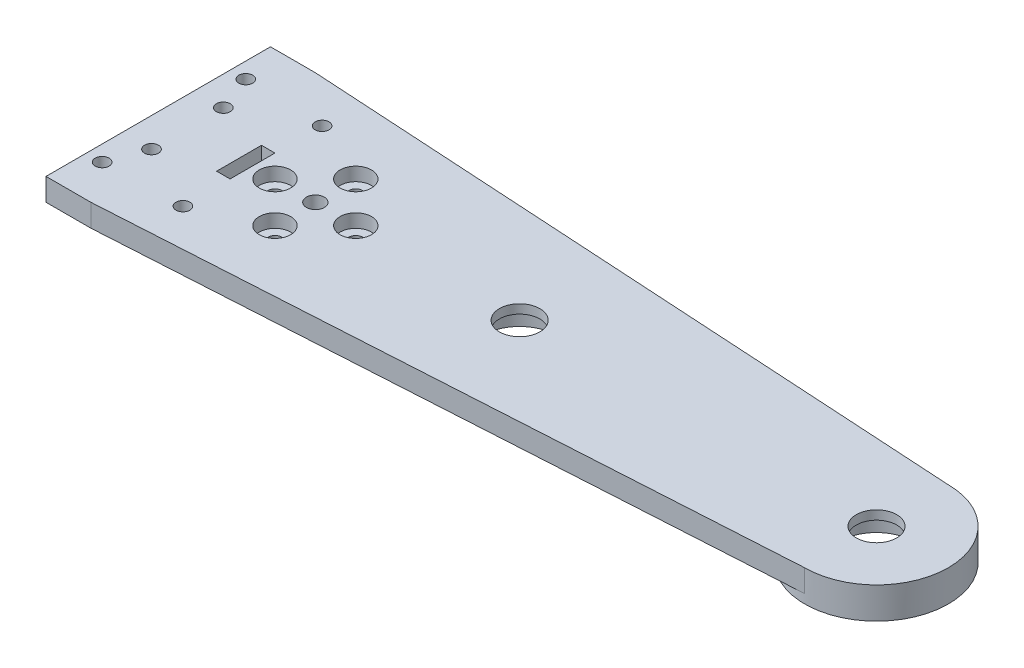
ISO-10303-21;
HEADER;
FILE_DESCRIPTION(('STEP AP214'),'2;1');
FILE_NAME('part.step','',(''),(''),'','','');
FILE_SCHEMA(('AUTOMOTIVE_DESIGN { 1 0 10303 214 1 1 1 1 }'));
ENDSEC;
DATA;
#1=APPLICATION_CONTEXT('core data for automotive mechanical design processes');
#2=APPLICATION_PROTOCOL_DEFINITION('international standard','automotive_design',2000,#1);
#3=PRODUCT_CONTEXT('',#1,'mechanical');
#4=PRODUCT('Part','Part','',(#3));
#5=PRODUCT_RELATED_PRODUCT_CATEGORY('part','',(#4));
#6=PRODUCT_DEFINITION_FORMATION('','',#4);
#7=PRODUCT_DEFINITION_CONTEXT('part definition',#1,'design');
#8=PRODUCT_DEFINITION('design','',#6,#7);
#9=PRODUCT_DEFINITION_SHAPE('','',#8);
#10=(LENGTH_UNIT() NAMED_UNIT(*) SI_UNIT(.MILLI.,.METRE.));
#11=(NAMED_UNIT(*) PLANE_ANGLE_UNIT() SI_UNIT($,.RADIAN.));
#12=(NAMED_UNIT(*) SI_UNIT($,.STERADIAN.) SOLID_ANGLE_UNIT());
#13=UNCERTAINTY_MEASURE_WITH_UNIT(LENGTH_MEASURE(1.E-05),#10,'distance_accuracy_value','');
#14=(GEOMETRIC_REPRESENTATION_CONTEXT(3) GLOBAL_UNCERTAINTY_ASSIGNED_CONTEXT((#13)) GLOBAL_UNIT_ASSIGNED_CONTEXT((#10,
#11,#12)) REPRESENTATION_CONTEXT('',''));
#15=CARTESIAN_POINT('',(0.,0.,0.));
#16=DIRECTION('',(0.,0.,1.));
#17=DIRECTION('',(1.,0.,0.));
#18=AXIS2_PLACEMENT_3D('',#15,#16,#17);
#19=CARTESIAN_POINT('',(-12.,-5.,-9.));
#20=DIRECTION('',(0.,1.,0.));
#21=DIRECTION('',(0.,0.,1.));
#22=AXIS2_PLACEMENT_3D('',#19,#20,#21);
#23=CYLINDRICAL_SURFACE('',#22,1.55);
#24=CARTESIAN_POINT('',(-12.,-5.,-9.));
#25=DIRECTION('',(0.,-1.,0.));
#26=DIRECTION('',(0.,0.,-1.));
#27=AXIS2_PLACEMENT_3D('',#24,#25,#26);
#28=CIRCLE('',#27,1.55);
#29=CARTESIAN_POINT('',(-12.,-5.,-10.55));
#30=VERTEX_POINT('',#29);
#31=EDGE_CURVE('E166',#30,#30,#28,.T.);
#32=ORIENTED_EDGE('',*,*,#31,.T.);
#33=EDGE_LOOP('',(#32));
#34=FACE_BOUND('',#33,.T.);
#35=CARTESIAN_POINT('',(-12.,-3.,-9.));
#36=DIRECTION('',(0.,1.,0.));
#37=DIRECTION('',(0.,0.,1.));
#38=AXIS2_PLACEMENT_3D('',#35,#36,#37);
#39=CIRCLE('',#38,1.55);
#40=CARTESIAN_POINT('',(-12.,-3.,-7.45));
#41=VERTEX_POINT('',#40);
#42=EDGE_CURVE('E42',#41,#41,#39,.T.);
#43=ORIENTED_EDGE('',*,*,#42,.T.);
#44=EDGE_LOOP('',(#43));
#45=FACE_BOUND('',#44,.T.);
#46=ADVANCED_FACE('F38',(#34,#45),#23,.F.);
#47=CARTESIAN_POINT('',(-21.,-5.,0.));
#48=DIRECTION('',(0.,1.,0.));
#49=DIRECTION('',(0.,0.,1.));
#50=AXIS2_PLACEMENT_3D('',#47,#48,#49);
#51=CYLINDRICAL_SURFACE('',#50,1.55);
#52=CARTESIAN_POINT('',(-21.,-5.,0.));
#53=DIRECTION('',(0.,-1.,0.));
#54=DIRECTION('',(0.,0.,-1.));
#55=AXIS2_PLACEMENT_3D('',#52,#53,#54);
#56=CIRCLE('',#55,1.55);
#57=CARTESIAN_POINT('',(-21.,-5.,-1.54999999999997));
#58=VERTEX_POINT('',#57);
#59=EDGE_CURVE('E163',#58,#58,#56,.T.);
#60=ORIENTED_EDGE('',*,*,#59,.T.);
#61=EDGE_LOOP('',(#60));
#62=FACE_BOUND('',#61,.T.);
#63=CARTESIAN_POINT('',(-21.,-3.,0.));
#64=DIRECTION('',(0.,1.,0.));
#65=DIRECTION('',(0.,0.,1.));
#66=AXIS2_PLACEMENT_3D('',#63,#64,#65);
#67=CIRCLE('',#66,1.55);
#68=CARTESIAN_POINT('',(-21.,-3.,1.55000000000003));
#69=VERTEX_POINT('',#68);
#70=EDGE_CURVE('E279',#69,#69,#67,.T.);
#71=ORIENTED_EDGE('',*,*,#70,.T.);
#72=EDGE_LOOP('',(#71));
#73=FACE_BOUND('',#72,.T.);
#74=ADVANCED_FACE('F382',(#62,#73),#51,.F.);
#75=CARTESIAN_POINT('',(-11.9999999999999,-5.,9.));
#76=DIRECTION('',(0.,1.,0.));
#77=DIRECTION('',(0.,0.,1.));
#78=AXIS2_PLACEMENT_3D('',#75,#76,#77);
#79=CYLINDRICAL_SURFACE('',#78,1.55);
#80=CARTESIAN_POINT('',(-11.9999999999999,-5.,9.));
#81=DIRECTION('',(0.,-1.,0.));
#82=DIRECTION('',(0.,0.,-1.));
#83=AXIS2_PLACEMENT_3D('',#80,#81,#82);
#84=CIRCLE('',#83,1.55);
#85=CARTESIAN_POINT('',(-11.9999999999999,-5.,7.45));
#86=VERTEX_POINT('',#85);
#87=EDGE_CURVE('E160',#86,#86,#84,.T.);
#88=ORIENTED_EDGE('',*,*,#87,.T.);
#89=EDGE_LOOP('',(#88));
#90=FACE_BOUND('',#89,.T.);
#91=CARTESIAN_POINT('',(-11.9999999999999,-3.,9.));
#92=DIRECTION('',(0.,1.,0.));
#93=DIRECTION('',(0.,0.,1.));
#94=AXIS2_PLACEMENT_3D('',#91,#92,#93);
#95=CIRCLE('',#94,1.55);
#96=CARTESIAN_POINT('',(-11.9999999999999,-3.,10.55));
#97=VERTEX_POINT('',#96);
#98=EDGE_CURVE('E276',#97,#97,#95,.T.);
#99=ORIENTED_EDGE('',*,*,#98,.T.);
#100=EDGE_LOOP('',(#99));
#101=FACE_BOUND('',#100,.T.);
#102=ADVANCED_FACE('F387',(#90,#101),#79,.F.);
#103=CARTESIAN_POINT('',(-2.99999999999999,-5.,0.));
#104=DIRECTION('',(0.,1.,0.));
#105=DIRECTION('',(0.,0.,1.));
#106=AXIS2_PLACEMENT_3D('',#103,#104,#105);
#107=CYLINDRICAL_SURFACE('',#106,1.55);
#108=CARTESIAN_POINT('',(-2.99999999999999,-5.,0.));
#109=DIRECTION('',(0.,-1.,0.));
#110=DIRECTION('',(0.,0.,-1.));
#111=AXIS2_PLACEMENT_3D('',#108,#109,#110);
#112=CIRCLE('',#111,1.55);
#113=CARTESIAN_POINT('',(-2.99999999999999,-5.,-1.55000000000009));
#114=VERTEX_POINT('',#113);
#115=EDGE_CURVE('E155',#114,#114,#112,.T.);
#116=ORIENTED_EDGE('',*,*,#115,.T.);
#117=EDGE_LOOP('',(#116));
#118=FACE_BOUND('',#117,.T.);
#119=CARTESIAN_POINT('',(-2.99999999999999,-3.,0.));
#120=DIRECTION('',(0.,1.,0.));
#121=DIRECTION('',(0.,0.,1.));
#122=AXIS2_PLACEMENT_3D('',#119,#120,#121);
#123=CIRCLE('',#122,1.55);
#124=CARTESIAN_POINT('',(-2.99999999999999,-3.,1.54999999999991));
#125=VERTEX_POINT('',#124);
#126=EDGE_CURVE('E273',#125,#125,#123,.T.);
#127=ORIENTED_EDGE('',*,*,#126,.T.);
#128=EDGE_LOOP('',(#127));
#129=FACE_BOUND('',#128,.T.);
#130=ADVANCED_FACE('F393',(#118,#129),#107,.F.);
#131=CARTESIAN_POINT('',(33.5,-5.,0.));
#132=DIRECTION('',(0.,1.,0.));
#133=DIRECTION('',(0.,0.,1.));
#134=AXIS2_PLACEMENT_3D('',#131,#132,#133);
#135=CYLINDRICAL_SURFACE('',#134,4.5);
#136=CARTESIAN_POINT('',(33.5,0.,0.));
#137=DIRECTION('',(0.,-1.,0.));
#138=DIRECTION('',(0.,0.,-1.));
#139=AXIS2_PLACEMENT_3D('',#136,#137,#138);
#140=CIRCLE('',#139,4.5);
#141=CARTESIAN_POINT('',(33.5,0.,-4.5));
#142=VERTEX_POINT('',#141);
#143=EDGE_CURVE('E231',#142,#142,#140,.T.);
#144=ORIENTED_EDGE('',*,*,#143,.F.);
#145=EDGE_LOOP('',(#144));
#146=FACE_BOUND('',#145,.T.);
#147=CARTESIAN_POINT('',(33.5,-2.,0.));
#148=DIRECTION('',(0.,-1.,0.));
#149=DIRECTION('',(0.,0.,-1.));
#150=AXIS2_PLACEMENT_3D('',#147,#148,#149);
#151=CIRCLE('',#150,4.5);
#152=CARTESIAN_POINT('',(33.5,-2.,-4.5));
#153=VERTEX_POINT('',#152);
#154=EDGE_CURVE('E142',#153,#153,#151,.T.);
#155=ORIENTED_EDGE('',*,*,#154,.T.);
#156=EDGE_LOOP('',(#155));
#157=FACE_BOUND('',#156,.T.);
#158=ADVANCED_FACE('F396',(#146,#157),#135,.F.);
#159=CARTESIAN_POINT('',(113.,-5.,0.));
#160=DIRECTION('',(0.,1.,0.));
#161=DIRECTION('',(0.,0.,1.));
#162=AXIS2_PLACEMENT_3D('',#159,#160,#161);
#163=CYLINDRICAL_SURFACE('',#162,4.5);
#164=CARTESIAN_POINT('',(113.,0.,0.));
#165=DIRECTION('',(0.,-1.,0.));
#166=DIRECTION('',(0.,0.,-1.));
#167=AXIS2_PLACEMENT_3D('',#164,#165,#166);
#168=CIRCLE('',#167,4.5);
#169=CARTESIAN_POINT('',(113.,0.,-4.49999999999999));
#170=VERTEX_POINT('',#169);
#171=EDGE_CURVE('E222',#170,#170,#168,.T.);
#172=ORIENTED_EDGE('',*,*,#171,.F.);
#173=EDGE_LOOP('',(#172));
#174=FACE_BOUND('',#173,.T.);
#175=CARTESIAN_POINT('',(113.,-2.,0.));
#176=DIRECTION('',(0.,-1.,0.));
#177=DIRECTION('',(0.,0.,-1.));
#178=AXIS2_PLACEMENT_3D('',#175,#176,#177);
#179=CIRCLE('',#178,4.5);
#180=CARTESIAN_POINT('',(113.,-2.,-4.49999999999999));
#181=VERTEX_POINT('',#180);
#182=EDGE_CURVE('E148',#181,#181,#179,.T.);
#183=ORIENTED_EDGE('',*,*,#182,.T.);
#184=EDGE_LOOP('',(#183));
#185=FACE_BOUND('',#184,.T.);
#186=ADVANCED_FACE('F520',(#174,#185),#163,.F.);
#187=CARTESIAN_POINT('',(113.,-5.,0.));
#188=DIRECTION('',(0.,-1.,0.));
#189=DIRECTION('',(0.,0.,-1.));
#190=AXIS2_PLACEMENT_3D('',#187,#188,#189);
#191=PLANE('',#190);
#192=ORIENTED_EDGE('',*,*,#115,.F.);
#193=EDGE_LOOP('',(#192));
#194=FACE_BOUND('',#193,.T.);
#195=ORIENTED_EDGE('',*,*,#59,.F.);
#196=EDGE_LOOP('',(#195));
#197=FACE_BOUND('',#196,.T.);
#198=CARTESIAN_POINT('',(-26.,-5.,15.5));
#199=DIRECTION('',(0.,-1.,0.));
#200=DIRECTION('',(0.,0.,-1.));
#201=AXIS2_PLACEMENT_3D('',#198,#199,#200);
#202=CIRCLE('',#201,1.55);
#203=CARTESIAN_POINT('',(-26.,-5.,13.95));
#204=VERTEX_POINT('',#203);
#205=EDGE_CURVE('E170',#204,#204,#202,.T.);
#206=ORIENTED_EDGE('',*,*,#205,.F.);
#207=EDGE_LOOP('',(#206));
#208=FACE_BOUND('',#207,.T.);
#209=DIRECTION('',(0.,0.,-1.));
#210=VECTOR('',#209,1.);
#211=CARTESIAN_POINT('',(-29.,-5.,-5.));
#212=LINE('',#211,#210);
#213=CARTESIAN_POINT('',(-29.,-5.,5.));
#214=VERTEX_POINT('',#213);
#215=CARTESIAN_POINT('',(-29.,-5.,-5.));
#216=VERTEX_POINT('',#215);
#217=EDGE_CURVE('E183',#214,#216,#212,.T.);
#218=ORIENTED_EDGE('',*,*,#217,.F.);
#219=DIRECTION('',(-1.,0.,0.));
#220=VECTOR('',#219,1.);
#221=CARTESIAN_POINT('',(-29.,-5.,5.));
#222=LINE('',#221,#220);
#223=CARTESIAN_POINT('',(-26.,-5.,5.));
#224=VERTEX_POINT('',#223);
#225=EDGE_CURVE('E181',#224,#214,#222,.T.);
#226=ORIENTED_EDGE('',*,*,#225,.F.);
#227=DIRECTION('',(0.,0.,1.));
#228=VECTOR('',#227,1.);
#229=CARTESIAN_POINT('',(-26.,-5.,5.));
#230=LINE('',#229,#228);
#231=CARTESIAN_POINT('',(-26.,-5.,-5.));
#232=VERTEX_POINT('',#231);
#233=EDGE_CURVE('E188',#232,#224,#230,.T.);
#234=ORIENTED_EDGE('',*,*,#233,.F.);
#235=DIRECTION('',(1.,0.,0.));
#236=VECTOR('',#235,1.);
#237=CARTESIAN_POINT('',(-26.,-5.,-5.));
#238=LINE('',#237,#236);
#239=EDGE_CURVE('E186',#216,#232,#238,.T.);
#240=ORIENTED_EDGE('',*,*,#239,.F.);
#241=EDGE_LOOP('',(#218,#226,#234,#240));
#242=FACE_BOUND('',#241,.T.);
#243=CARTESIAN_POINT('',(-43.5,-5.,-16.));
#244=DIRECTION('',(0.,-1.,0.));
#245=DIRECTION('',(0.,0.,-1.));
#246=AXIS2_PLACEMENT_3D('',#243,#244,#245);
#247=CIRCLE('',#246,1.55);
#248=CARTESIAN_POINT('',(-43.5,-5.,-17.55));
#249=VERTEX_POINT('',#248);
#250=EDGE_CURVE('E207',#249,#249,#247,.T.);
#251=ORIENTED_EDGE('',*,*,#250,.F.);
#252=EDGE_LOOP('',(#251));
#253=FACE_BOUND('',#252,.T.);
#254=CARTESIAN_POINT('',(-40.5,-5.,-7.99999999999999));
#255=DIRECTION('',(0.,-1.,0.));
#256=DIRECTION('',(0.,0.,-1.));
#257=AXIS2_PLACEMENT_3D('',#254,#255,#256);
#258=CIRCLE('',#257,1.55);
#259=CARTESIAN_POINT('',(-40.5,-5.,-9.54999999999999));
#260=VERTEX_POINT('',#259);
#261=EDGE_CURVE('E219',#260,#260,#258,.T.);
#262=ORIENTED_EDGE('',*,*,#261,.F.);
#263=EDGE_LOOP('',(#262));
#264=FACE_BOUND('',#263,.T.);
#265=CARTESIAN_POINT('',(-40.5,-5.,8.00000000000001));
#266=DIRECTION('',(0.,-1.,0.));
#267=DIRECTION('',(0.,0.,-1.));
#268=AXIS2_PLACEMENT_3D('',#265,#266,#267);
#269=CIRCLE('',#268,1.55);
#270=CARTESIAN_POINT('',(-40.5,-5.,6.45000000000001));
#271=VERTEX_POINT('',#270);
#272=EDGE_CURVE('E228',#271,#271,#269,.T.);
#273=ORIENTED_EDGE('',*,*,#272,.F.);
#274=EDGE_LOOP('',(#273));
#275=FACE_BOUND('',#274,.T.);
#276=CARTESIAN_POINT('',(-12.,-5.,0.));
#277=DIRECTION('',(0.,-1.,0.));
#278=DIRECTION('',(0.,0.,-1.));
#279=AXIS2_PLACEMENT_3D('',#276,#277,#278);
#280=CIRCLE('',#279,2.);
#281=CARTESIAN_POINT('',(-12.,-5.,-2.));
#282=VERTEX_POINT('',#281);
#283=EDGE_CURVE('E237',#282,#282,#280,.T.);
#284=ORIENTED_EDGE('',*,*,#283,.F.);
#285=EDGE_LOOP('',(#284));
#286=FACE_BOUND('',#285,.T.);
#287=CARTESIAN_POINT('',(-43.5,-5.,16.));
#288=DIRECTION('',(0.,-1.,0.));
#289=DIRECTION('',(0.,0.,-1.));
#290=AXIS2_PLACEMENT_3D('',#287,#288,#289);
#291=CIRCLE('',#290,1.55);
#292=CARTESIAN_POINT('',(-43.5,-5.,14.45));
#293=VERTEX_POINT('',#292);
#294=EDGE_CURVE('E213',#293,#293,#291,.T.);
#295=ORIENTED_EDGE('',*,*,#294,.F.);
#296=EDGE_LOOP('',(#295));
#297=FACE_BOUND('',#296,.T.);
#298=CARTESIAN_POINT('',(-26.,-5.,-15.5));
#299=DIRECTION('',(0.,-1.,0.));
#300=DIRECTION('',(0.,0.,-1.));
#301=AXIS2_PLACEMENT_3D('',#298,#299,#300);
#302=CIRCLE('',#301,1.55);
#303=CARTESIAN_POINT('',(-26.,-5.,-17.05));
#304=VERTEX_POINT('',#303);
#305=EDGE_CURVE('E176',#304,#304,#302,.T.);
#306=ORIENTED_EDGE('',*,*,#305,.F.);
#307=EDGE_LOOP('',(#306));
#308=FACE_BOUND('',#307,.T.);
#309=ORIENTED_EDGE('',*,*,#31,.F.);
#310=EDGE_LOOP('',(#309));
#311=FACE_BOUND('',#310,.T.);
#312=ORIENTED_EDGE('',*,*,#87,.F.);
#313=EDGE_LOOP('',(#312));
#314=FACE_BOUND('',#313,.T.);
#315=CARTESIAN_POINT('',(33.5,-5.,0.));
#316=DIRECTION('',(0.,-1.,0.));
#317=DIRECTION('',(0.,0.,-1.));
#318=AXIS2_PLACEMENT_3D('',#315,#316,#317);
#319=CIRCLE('',#318,16.);
#320=CARTESIAN_POINT('',(33.5,-5.,-16.));
#321=VERTEX_POINT('',#320);
#322=EDGE_CURVE('E145',#321,#321,#319,.T.);
#323=ORIENTED_EDGE('',*,*,#322,.F.);
#324=EDGE_LOOP('',(#323));
#325=FACE_BOUND('',#324,.T.);
#326=DIRECTION('',(0.998204845465779,0.,0.0598922907279467));
#327=VECTOR('',#326,1.);
#328=CARTESIAN_POINT('',(-37.,-5.,-25.));
#329=LINE('',#328,#327);
#330=CARTESIAN_POINT('',(-37.,-5.,-25.));
#331=VERTEX_POINT('',#330);
#332=CARTESIAN_POINT('',(113.,-5.,-16.));
#333=VERTEX_POINT('',#332);
#334=EDGE_CURVE('E129',#331,#333,#329,.T.);
#335=ORIENTED_EDGE('',*,*,#334,.T.);
#336=CARTESIAN_POINT('',(113.,-5.,0.));
#337=DIRECTION('',(0.,-1.,0.));
#338=DIRECTION('',(0.,0.,-1.));
#339=AXIS2_PLACEMENT_3D('',#336,#337,#338);
#340=CIRCLE('',#339,16.);
#341=CARTESIAN_POINT('',(113.,-5.,16.));
#342=VERTEX_POINT('',#341);
#343=EDGE_CURVE('E135',#342,#333,#340,.T.);
#344=ORIENTED_EDGE('',*,*,#343,.F.);
#345=DIRECTION('',(-0.998204845465779,0.,0.0598922907279467));
#346=VECTOR('',#345,1.);
#347=CARTESIAN_POINT('',(113.,-5.,16.));
#348=LINE('',#347,#346);
#349=CARTESIAN_POINT('',(-37.,-5.,25.));
#350=VERTEX_POINT('',#349);
#351=EDGE_CURVE('E119',#342,#350,#348,.T.);
#352=ORIENTED_EDGE('',*,*,#351,.T.);
#353=DIRECTION('',(-1.,0.,0.));
#354=VECTOR('',#353,1.);
#355=CARTESIAN_POINT('',(-47.,-5.,25.));
#356=LINE('',#355,#354);
#357=CARTESIAN_POINT('',(-47.,-5.,25.));
#358=VERTEX_POINT('',#357);
#359=EDGE_CURVE('E128',#350,#358,#356,.T.);
#360=ORIENTED_EDGE('',*,*,#359,.T.);
#361=DIRECTION('',(0.,0.,-1.));
#362=VECTOR('',#361,1.);
#363=CARTESIAN_POINT('',(-47.,-5.,-25.));
#364=LINE('',#363,#362);
#365=CARTESIAN_POINT('',(-47.,-5.,-25.));
#366=VERTEX_POINT('',#365);
#367=EDGE_CURVE('E246',#358,#366,#364,.T.);
#368=ORIENTED_EDGE('',*,*,#367,.T.);
#369=DIRECTION('',(1.,0.,0.));
#370=VECTOR('',#369,1.);
#371=CARTESIAN_POINT('',(-47.,-5.,-25.));
#372=LINE('',#371,#370);
#373=EDGE_CURVE('E248',#366,#331,#372,.T.);
#374=ORIENTED_EDGE('',*,*,#373,.T.);
#375=EDGE_LOOP('',(#335,#344,#352,#360,#368,#374));
#376=FACE_BOUND('',#375,.T.);
#377=ADVANCED_FACE('F138',(#194,#197,#208,#242,#253,#264,#275,#286,#297,#308,#311,#314,#325,
#376),#191,.T.);
#378=CARTESIAN_POINT('',(113.,0.,0.));
#379=DIRECTION('',(0.,-1.,0.));
#380=DIRECTION('',(0.,0.,-1.));
#381=AXIS2_PLACEMENT_3D('',#378,#379,#380);
#382=PLANE('',#381);
#383=CARTESIAN_POINT('',(-12.,0.,-9.));
#384=DIRECTION('',(0.,1.,0.));
#385=DIRECTION('',(0.,0.,1.));
#386=AXIS2_PLACEMENT_3D('',#383,#384,#385);
#387=CIRCLE('',#386,3.5);
#388=CARTESIAN_POINT('',(-12.,0.,-5.5));
#389=VERTEX_POINT('',#388);
#390=EDGE_CURVE('E317',#389,#389,#387,.T.);
#391=ORIENTED_EDGE('',*,*,#390,.F.);
#392=EDGE_LOOP('',(#391));
#393=FACE_BOUND('',#392,.T.);
#394=CARTESIAN_POINT('',(-2.99999999999999,0.,0.));
#395=DIRECTION('',(0.,1.,0.));
#396=DIRECTION('',(0.,0.,1.));
#397=AXIS2_PLACEMENT_3D('',#394,#395,#396);
#398=CIRCLE('',#397,3.5);
#399=CARTESIAN_POINT('',(-2.99999999999999,0.,3.50000000000003));
#400=VERTEX_POINT('',#399);
#401=EDGE_CURVE('E311',#400,#400,#398,.T.);
#402=ORIENTED_EDGE('',*,*,#401,.F.);
#403=EDGE_LOOP('',(#402));
#404=FACE_BOUND('',#403,.T.);
#405=CARTESIAN_POINT('',(-12.,0.,9.));
#406=DIRECTION('',(0.,1.,0.));
#407=DIRECTION('',(0.,0.,1.));
#408=AXIS2_PLACEMENT_3D('',#405,#406,#407);
#409=CIRCLE('',#408,3.5);
#410=CARTESIAN_POINT('',(-12.,0.,12.5));
#411=VERTEX_POINT('',#410);
#412=EDGE_CURVE('E305',#411,#411,#409,.T.);
#413=ORIENTED_EDGE('',*,*,#412,.F.);
#414=EDGE_LOOP('',(#413));
#415=FACE_BOUND('',#414,.T.);
#416=CARTESIAN_POINT('',(-21.,0.,0.));
#417=DIRECTION('',(0.,1.,0.));
#418=DIRECTION('',(0.,0.,1.));
#419=AXIS2_PLACEMENT_3D('',#416,#417,#418);
#420=CIRCLE('',#419,3.5);
#421=CARTESIAN_POINT('',(-21.,0.,3.49999999999991));
#422=VERTEX_POINT('',#421);
#423=EDGE_CURVE('E299',#422,#422,#420,.T.);
#424=ORIENTED_EDGE('',*,*,#423,.F.);
#425=EDGE_LOOP('',(#424));
#426=FACE_BOUND('',#425,.T.);
#427=CARTESIAN_POINT('',(-43.5,0.,-16.));
#428=DIRECTION('',(0.,-1.,0.));
#429=DIRECTION('',(0.,0.,-1.));
#430=AXIS2_PLACEMENT_3D('',#427,#428,#429);
#431=CIRCLE('',#430,1.55);
#432=CARTESIAN_POINT('',(-43.5,0.,-17.55));
#433=VERTEX_POINT('',#432);
#434=EDGE_CURVE('E206',#433,#433,#431,.T.);
#435=ORIENTED_EDGE('',*,*,#434,.T.);
#436=EDGE_LOOP('',(#435));
#437=FACE_BOUND('',#436,.T.);
#438=CARTESIAN_POINT('',(-43.5,0.,16.));
#439=DIRECTION('',(0.,-1.,0.));
#440=DIRECTION('',(0.,0.,-1.));
#441=AXIS2_PLACEMENT_3D('',#438,#439,#440);
#442=CIRCLE('',#441,1.55);
#443=CARTESIAN_POINT('',(-43.5,0.,14.45));
#444=VERTEX_POINT('',#443);
#445=EDGE_CURVE('E210',#444,#444,#442,.T.);
#446=ORIENTED_EDGE('',*,*,#445,.T.);
#447=EDGE_LOOP('',(#446));
#448=FACE_BOUND('',#447,.T.);
#449=CARTESIAN_POINT('',(-40.5,0.,-7.99999999999999));
#450=DIRECTION('',(0.,-1.,0.));
#451=DIRECTION('',(0.,0.,-1.));
#452=AXIS2_PLACEMENT_3D('',#449,#450,#451);
#453=CIRCLE('',#452,1.55);
#454=CARTESIAN_POINT('',(-40.5,0.,-9.54999999999999));
#455=VERTEX_POINT('',#454);
#456=EDGE_CURVE('E216',#455,#455,#453,.T.);
#457=ORIENTED_EDGE('',*,*,#456,.T.);
#458=EDGE_LOOP('',(#457));
#459=FACE_BOUND('',#458,.T.);
#460=ORIENTED_EDGE('',*,*,#171,.T.);
#461=EDGE_LOOP('',(#460));
#462=FACE_BOUND('',#461,.T.);
#463=CARTESIAN_POINT('',(-40.5,0.,8.00000000000001));
#464=DIRECTION('',(0.,-1.,0.));
#465=DIRECTION('',(0.,0.,-1.));
#466=AXIS2_PLACEMENT_3D('',#463,#464,#465);
#467=CIRCLE('',#466,1.55);
#468=CARTESIAN_POINT('',(-40.5,0.,6.45000000000001));
#469=VERTEX_POINT('',#468);
#470=EDGE_CURVE('E227',#469,#469,#467,.T.);
#471=ORIENTED_EDGE('',*,*,#470,.T.);
#472=EDGE_LOOP('',(#471));
#473=FACE_BOUND('',#472,.T.);
#474=ORIENTED_EDGE('',*,*,#143,.T.);
#475=EDGE_LOOP('',(#474));
#476=FACE_BOUND('',#475,.T.);
#477=CARTESIAN_POINT('',(-12.,0.,0.));
#478=DIRECTION('',(0.,-1.,0.));
#479=DIRECTION('',(0.,0.,-1.));
#480=AXIS2_PLACEMENT_3D('',#477,#478,#479);
#481=CIRCLE('',#480,2.);
#482=CARTESIAN_POINT('',(-12.,0.,-2.));
#483=VERTEX_POINT('',#482);
#484=EDGE_CURVE('E236',#483,#483,#481,.T.);
#485=ORIENTED_EDGE('',*,*,#484,.T.);
#486=EDGE_LOOP('',(#485));
#487=FACE_BOUND('',#486,.T.);
#488=DIRECTION('',(0.998204845465779,0.,0.0598922907279467));
#489=VECTOR('',#488,1.);
#490=CARTESIAN_POINT('',(-37.,0.,-25.));
#491=LINE('',#490,#489);
#492=CARTESIAN_POINT('',(-37.,0.,-25.));
#493=VERTEX_POINT('',#492);
#494=CARTESIAN_POINT('',(113.,0.,-16.));
#495=VERTEX_POINT('',#494);
#496=EDGE_CURVE('E240',#493,#495,#491,.T.);
#497=ORIENTED_EDGE('',*,*,#496,.F.);
#498=DIRECTION('',(1.,0.,0.));
#499=VECTOR('',#498,1.);
#500=CARTESIAN_POINT('',(-47.,0.,-25.));
#501=LINE('',#500,#499);
#502=CARTESIAN_POINT('',(-47.,0.,-25.));
#503=VERTEX_POINT('',#502);
#504=EDGE_CURVE('E243',#503,#493,#501,.T.);
#505=ORIENTED_EDGE('',*,*,#504,.F.);
#506=DIRECTION('',(0.,0.,-1.));
#507=VECTOR('',#506,1.);
#508=CARTESIAN_POINT('',(-47.,0.,-25.));
#509=LINE('',#508,#507);
#510=CARTESIAN_POINT('',(-47.,0.,25.));
#511=VERTEX_POINT('',#510);
#512=EDGE_CURVE('E258',#511,#503,#509,.T.);
#513=ORIENTED_EDGE('',*,*,#512,.F.);
#514=DIRECTION('',(-1.,0.,0.));
#515=VECTOR('',#514,1.);
#516=CARTESIAN_POINT('',(-47.,0.,25.));
#517=LINE('',#516,#515);
#518=CARTESIAN_POINT('',(-37.,0.,25.));
#519=VERTEX_POINT('',#518);
#520=EDGE_CURVE('E256',#519,#511,#517,.T.);
#521=ORIENTED_EDGE('',*,*,#520,.F.);
#522=DIRECTION('',(-0.998204845465779,0.,0.0598922907279467));
#523=VECTOR('',#522,1.);
#524=CARTESIAN_POINT('',(113.,0.,16.));
#525=LINE('',#524,#523);
#526=CARTESIAN_POINT('',(113.,0.,16.));
#527=VERTEX_POINT('',#526);
#528=EDGE_CURVE('E254',#527,#519,#525,.T.);
#529=ORIENTED_EDGE('',*,*,#528,.F.);
#530=CARTESIAN_POINT('',(113.,0.,0.));
#531=DIRECTION('',(0.,-1.,0.));
#532=DIRECTION('',(0.,0.,-1.));
#533=AXIS2_PLACEMENT_3D('',#530,#531,#532);
#534=CIRCLE('',#533,16.);
#535=EDGE_CURVE('E136',#495,#527,#534,.T.);
#536=ORIENTED_EDGE('',*,*,#535,.F.);
#537=EDGE_LOOP('',(#497,#505,#513,#521,#529,#536));
#538=FACE_BOUND('',#537,.T.);
#539=DIRECTION('',(-1.,0.,0.));
#540=VECTOR('',#539,1.);
#541=CARTESIAN_POINT('',(-29.,0.,5.));
#542=LINE('',#541,#540);
#543=CARTESIAN_POINT('',(-26.,0.,5.));
#544=VERTEX_POINT('',#543);
#545=CARTESIAN_POINT('',(-29.,0.,5.));
#546=VERTEX_POINT('',#545);
#547=EDGE_CURVE('E63',#544,#546,#542,.T.);
#548=ORIENTED_EDGE('',*,*,#547,.T.);
#549=DIRECTION('',(0.,0.,-1.));
#550=VECTOR('',#549,1.);
#551=CARTESIAN_POINT('',(-29.,0.,-5.));
#552=LINE('',#551,#550);
#553=CARTESIAN_POINT('',(-29.,0.,-5.));
#554=VERTEX_POINT('',#553);
#555=EDGE_CURVE('E192',#546,#554,#552,.T.);
#556=ORIENTED_EDGE('',*,*,#555,.T.);
#557=DIRECTION('',(1.,0.,0.));
#558=VECTOR('',#557,1.);
#559=CARTESIAN_POINT('',(-26.,0.,-5.));
#560=LINE('',#559,#558);
#561=CARTESIAN_POINT('',(-26.,0.,-5.));
#562=VERTEX_POINT('',#561);
#563=EDGE_CURVE('E195',#554,#562,#560,.T.);
#564=ORIENTED_EDGE('',*,*,#563,.T.);
#565=DIRECTION('',(0.,0.,1.));
#566=VECTOR('',#565,1.);
#567=CARTESIAN_POINT('',(-26.,0.,5.));
#568=LINE('',#567,#566);
#569=EDGE_CURVE('E184',#562,#544,#568,.T.);
#570=ORIENTED_EDGE('',*,*,#569,.T.);
#571=EDGE_LOOP('',(#548,#556,#564,#570));
#572=FACE_BOUND('',#571,.T.);
#573=CARTESIAN_POINT('',(-26.,0.,-15.5));
#574=DIRECTION('',(0.,-1.,0.));
#575=DIRECTION('',(0.,0.,-1.));
#576=AXIS2_PLACEMENT_3D('',#573,#574,#575);
#577=CIRCLE('',#576,1.55);
#578=CARTESIAN_POINT('',(-26.,0.,-17.05));
#579=VERTEX_POINT('',#578);
#580=EDGE_CURVE('E173',#579,#579,#577,.T.);
#581=ORIENTED_EDGE('',*,*,#580,.T.);
#582=EDGE_LOOP('',(#581));
#583=FACE_BOUND('',#582,.T.);
#584=CARTESIAN_POINT('',(-26.,0.,15.5));
#585=DIRECTION('',(0.,-1.,0.));
#586=DIRECTION('',(0.,0.,-1.));
#587=AXIS2_PLACEMENT_3D('',#584,#585,#586);
#588=CIRCLE('',#587,1.55);
#589=CARTESIAN_POINT('',(-26.,0.,13.95));
#590=VERTEX_POINT('',#589);
#591=EDGE_CURVE('E169',#590,#590,#588,.T.);
#592=ORIENTED_EDGE('',*,*,#591,.T.);
#593=EDGE_LOOP('',(#592));
#594=FACE_BOUND('',#593,.T.);
#595=ADVANCED_FACE('F332',(#393,#404,#415,#426,#437,#448,#459,#462,#473,#476,#487,#538,#572,
#583,#594),#382,.F.);
#596=CARTESIAN_POINT('',(-37.,-5.,-25.));
#597=DIRECTION('',(-0.0598922907279467,0.,0.998204845465779));
#598=DIRECTION('',(0.998204845465779,0.,0.0598922907279467));
#599=AXIS2_PLACEMENT_3D('',#596,#597,#598);
#600=PLANE('',#599);
#601=ORIENTED_EDGE('',*,*,#496,.T.);
#602=DIRECTION('',(0.,1.,0.));
#603=VECTOR('',#602,1.);
#604=CARTESIAN_POINT('',(113.,-5.,-16.));
#605=LINE('',#604,#603);
#606=EDGE_CURVE('E11',#333,#495,#605,.T.);
#607=ORIENTED_EDGE('',*,*,#606,.F.);
#608=ORIENTED_EDGE('',*,*,#334,.F.);
#609=DIRECTION('',(0.,1.,0.));
#610=VECTOR('',#609,1.);
#611=CARTESIAN_POINT('',(-37.,-5.,-25.));
#612=LINE('',#611,#610);
#613=EDGE_CURVE('E250',#331,#493,#612,.T.);
#614=ORIENTED_EDGE('',*,*,#613,.T.);
#615=EDGE_LOOP('',(#601,#607,#608,#614));
#616=FACE_BOUND('',#615,.T.);
#617=ADVANCED_FACE('F40',(#616),#600,.F.);
#618=CARTESIAN_POINT('',(113.,-5.,0.));
#619=DIRECTION('',(0.,1.,0.));
#620=DIRECTION('',(0.,0.,1.));
#621=AXIS2_PLACEMENT_3D('',#618,#619,#620);
#622=CYLINDRICAL_SURFACE('',#621,16.);
#623=ORIENTED_EDGE('',*,*,#535,.T.);
#624=DIRECTION('',(0.,1.,0.));
#625=VECTOR('',#624,1.);
#626=CARTESIAN_POINT('',(113.,-5.,16.));
#627=LINE('',#626,#625);
#628=EDGE_CURVE('E47',#342,#527,#627,.T.);
#629=ORIENTED_EDGE('',*,*,#628,.F.);
#630=ORIENTED_EDGE('',*,*,#343,.T.);
#631=ORIENTED_EDGE('',*,*,#606,.T.);
#632=EDGE_LOOP('',(#623,#629,#630,#631));
#633=FACE_BOUND('',#632,.T.);
#634=CARTESIAN_POINT('',(113.,-7.,0.));
#635=DIRECTION('',(0.,-1.,0.));
#636=DIRECTION('',(0.,0.,-1.));
#637=AXIS2_PLACEMENT_3D('',#634,#635,#636);
#638=CIRCLE('',#637,16.);
#639=CARTESIAN_POINT('',(113.,-7.,-16.));
#640=VERTEX_POINT('',#639);
#641=EDGE_CURVE('E141',#640,#640,#638,.T.);
#642=ORIENTED_EDGE('',*,*,#641,.F.);
#643=EDGE_LOOP('',(#642));
#644=FACE_BOUND('',#643,.T.);
#645=ADVANCED_FACE('F133',(#633,#644),#622,.T.);
#646=CARTESIAN_POINT('',(113.,-5.,16.));
#647=DIRECTION('',(-0.0598922907279467,0.,-0.998204845465779));
#648=DIRECTION('',(-0.998204845465779,0.,0.0598922907279467));
#649=AXIS2_PLACEMENT_3D('',#646,#647,#648);
#650=PLANE('',#649);
#651=ORIENTED_EDGE('',*,*,#528,.T.);
#652=DIRECTION('',(0.,1.,0.));
#653=VECTOR('',#652,1.);
#654=CARTESIAN_POINT('',(-37.,-5.,25.));
#655=LINE('',#654,#653);
#656=EDGE_CURVE('E124',#350,#519,#655,.T.);
#657=ORIENTED_EDGE('',*,*,#656,.F.);
#658=ORIENTED_EDGE('',*,*,#351,.F.);
#659=ORIENTED_EDGE('',*,*,#628,.T.);
#660=EDGE_LOOP('',(#651,#657,#658,#659));
#661=FACE_BOUND('',#660,.T.);
#662=ADVANCED_FACE('F121',(#661),#650,.F.);
#663=CARTESIAN_POINT('',(-47.,-5.,25.));
#664=DIRECTION('',(0.,0.,-1.));
#665=DIRECTION('',(-1.,0.,0.));
#666=AXIS2_PLACEMENT_3D('',#663,#664,#665);
#667=PLANE('',#666);
#668=ORIENTED_EDGE('',*,*,#520,.T.);
#669=DIRECTION('',(0.,1.,0.));
#670=VECTOR('',#669,1.);
#671=CARTESIAN_POINT('',(-47.,-5.,25.));
#672=LINE('',#671,#670);
#673=EDGE_CURVE('E266',#358,#511,#672,.T.);
#674=ORIENTED_EDGE('',*,*,#673,.F.);
#675=ORIENTED_EDGE('',*,*,#359,.F.);
#676=ORIENTED_EDGE('',*,*,#656,.T.);
#677=EDGE_LOOP('',(#668,#674,#675,#676));
#678=FACE_BOUND('',#677,.T.);
#679=ADVANCED_FACE('F555',(#678),#667,.F.);
#680=CARTESIAN_POINT('',(-47.,-5.,-25.));
#681=DIRECTION('',(1.,0.,0.));
#682=DIRECTION('',(0.,0.,-1.));
#683=AXIS2_PLACEMENT_3D('',#680,#681,#682);
#684=PLANE('',#683);
#685=ORIENTED_EDGE('',*,*,#512,.T.);
#686=DIRECTION('',(0.,1.,0.));
#687=VECTOR('',#686,1.);
#688=CARTESIAN_POINT('',(-47.,-5.,-25.));
#689=LINE('',#688,#687);
#690=EDGE_CURVE('E263',#366,#503,#689,.T.);
#691=ORIENTED_EDGE('',*,*,#690,.F.);
#692=ORIENTED_EDGE('',*,*,#367,.F.);
#693=ORIENTED_EDGE('',*,*,#673,.T.);
#694=EDGE_LOOP('',(#685,#691,#692,#693));
#695=FACE_BOUND('',#694,.T.);
#696=ADVANCED_FACE('F562',(#695),#684,.F.);
#697=CARTESIAN_POINT('',(-47.,-5.,-25.));
#698=DIRECTION('',(0.,0.,1.));
#699=DIRECTION('',(1.,0.,0.));
#700=AXIS2_PLACEMENT_3D('',#697,#698,#699);
#701=PLANE('',#700);
#702=ORIENTED_EDGE('',*,*,#504,.T.);
#703=ORIENTED_EDGE('',*,*,#613,.F.);
#704=ORIENTED_EDGE('',*,*,#373,.F.);
#705=ORIENTED_EDGE('',*,*,#690,.T.);
#706=EDGE_LOOP('',(#702,#703,#704,#705));
#707=FACE_BOUND('',#706,.T.);
#708=ADVANCED_FACE('F570',(#707),#701,.F.);
#709=CARTESIAN_POINT('',(-12.,-5.,0.));
#710=DIRECTION('',(0.,1.,0.));
#711=DIRECTION('',(0.,0.,1.));
#712=AXIS2_PLACEMENT_3D('',#709,#710,#711);
#713=CYLINDRICAL_SURFACE('',#712,2.);
#714=ORIENTED_EDGE('',*,*,#283,.T.);
#715=EDGE_LOOP('',(#714));
#716=FACE_BOUND('',#715,.T.);
#717=ORIENTED_EDGE('',*,*,#484,.F.);
#718=EDGE_LOOP('',(#717));
#719=FACE_BOUND('',#718,.T.);
#720=ADVANCED_FACE('F578',(#716,#719),#713,.F.);
#721=CARTESIAN_POINT('',(-40.5,-5.,8.00000000000001));
#722=DIRECTION('',(0.,1.,0.));
#723=DIRECTION('',(0.,0.,1.));
#724=AXIS2_PLACEMENT_3D('',#721,#722,#723);
#725=CYLINDRICAL_SURFACE('',#724,1.55);
#726=ORIENTED_EDGE('',*,*,#272,.T.);
#727=EDGE_LOOP('',(#726));
#728=FACE_BOUND('',#727,.T.);
#729=ORIENTED_EDGE('',*,*,#470,.F.);
#730=EDGE_LOOP('',(#729));
#731=FACE_BOUND('',#730,.T.);
#732=ADVANCED_FACE('F586',(#728,#731),#725,.F.);
#733=CARTESIAN_POINT('',(-40.5,-5.,-7.99999999999999));
#734=DIRECTION('',(0.,1.,0.));
#735=DIRECTION('',(0.,0.,1.));
#736=AXIS2_PLACEMENT_3D('',#733,#734,#735);
#737=CYLINDRICAL_SURFACE('',#736,1.55);
#738=ORIENTED_EDGE('',*,*,#261,.T.);
#739=EDGE_LOOP('',(#738));
#740=FACE_BOUND('',#739,.T.);
#741=ORIENTED_EDGE('',*,*,#456,.F.);
#742=EDGE_LOOP('',(#741));
#743=FACE_BOUND('',#742,.T.);
#744=ADVANCED_FACE('F594',(#740,#743),#737,.F.);
#745=CARTESIAN_POINT('',(-43.5,-5.,16.));
#746=DIRECTION('',(0.,1.,0.));
#747=DIRECTION('',(0.,0.,1.));
#748=AXIS2_PLACEMENT_3D('',#745,#746,#747);
#749=CYLINDRICAL_SURFACE('',#748,1.55);
#750=ORIENTED_EDGE('',*,*,#294,.T.);
#751=EDGE_LOOP('',(#750));
#752=FACE_BOUND('',#751,.T.);
#753=ORIENTED_EDGE('',*,*,#445,.F.);
#754=EDGE_LOOP('',(#753));
#755=FACE_BOUND('',#754,.T.);
#756=ADVANCED_FACE('F602',(#752,#755),#749,.F.);
#757=CARTESIAN_POINT('',(-43.5,-5.,-16.));
#758=DIRECTION('',(0.,1.,0.));
#759=DIRECTION('',(0.,0.,1.));
#760=AXIS2_PLACEMENT_3D('',#757,#758,#759);
#761=CYLINDRICAL_SURFACE('',#760,1.55);
#762=ORIENTED_EDGE('',*,*,#250,.T.);
#763=EDGE_LOOP('',(#762));
#764=FACE_BOUND('',#763,.T.);
#765=ORIENTED_EDGE('',*,*,#434,.F.);
#766=EDGE_LOOP('',(#765));
#767=FACE_BOUND('',#766,.T.);
#768=ADVANCED_FACE('F610',(#764,#767),#761,.F.);
#769=CARTESIAN_POINT('',(-29.,-5.,5.));
#770=DIRECTION('',(0.,0.,-1.));
#771=DIRECTION('',(-1.,0.,0.));
#772=AXIS2_PLACEMENT_3D('',#769,#770,#771);
#773=PLANE('',#772);
#774=ORIENTED_EDGE('',*,*,#547,.F.);
#775=DIRECTION('',(0.,1.,0.));
#776=VECTOR('',#775,1.);
#777=CARTESIAN_POINT('',(-26.,-5.,5.));
#778=LINE('',#777,#776);
#779=EDGE_CURVE('E190',#224,#544,#778,.T.);
#780=ORIENTED_EDGE('',*,*,#779,.F.);
#781=ORIENTED_EDGE('',*,*,#225,.T.);
#782=DIRECTION('',(0.,1.,0.));
#783=VECTOR('',#782,1.);
#784=CARTESIAN_POINT('',(-29.,-5.,5.));
#785=LINE('',#784,#783);
#786=EDGE_CURVE('E204',#214,#546,#785,.T.);
#787=ORIENTED_EDGE('',*,*,#786,.T.);
#788=EDGE_LOOP('',(#774,#780,#781,#787));
#789=FACE_BOUND('',#788,.T.);
#790=ADVANCED_FACE('F618',(#789),#773,.T.);
#791=CARTESIAN_POINT('',(-29.,-5.,-5.));
#792=DIRECTION('',(1.,0.,0.));
#793=DIRECTION('',(0.,0.,-1.));
#794=AXIS2_PLACEMENT_3D('',#791,#792,#793);
#795=PLANE('',#794);
#796=ORIENTED_EDGE('',*,*,#555,.F.);
#797=ORIENTED_EDGE('',*,*,#786,.F.);
#798=ORIENTED_EDGE('',*,*,#217,.T.);
#799=DIRECTION('',(0.,1.,0.));
#800=VECTOR('',#799,1.);
#801=CARTESIAN_POINT('',(-29.,-5.,-5.));
#802=LINE('',#801,#800);
#803=EDGE_CURVE('E202',#216,#554,#802,.T.);
#804=ORIENTED_EDGE('',*,*,#803,.T.);
#805=EDGE_LOOP('',(#796,#797,#798,#804));
#806=FACE_BOUND('',#805,.T.);
#807=ADVANCED_FACE('F626',(#806),#795,.T.);
#808=CARTESIAN_POINT('',(-26.,-5.,-5.));
#809=DIRECTION('',(0.,0.,1.));
#810=DIRECTION('',(1.,0.,0.));
#811=AXIS2_PLACEMENT_3D('',#808,#809,#810);
#812=PLANE('',#811);
#813=ORIENTED_EDGE('',*,*,#563,.F.);
#814=ORIENTED_EDGE('',*,*,#803,.F.);
#815=ORIENTED_EDGE('',*,*,#239,.T.);
#816=DIRECTION('',(0.,1.,0.));
#817=VECTOR('',#816,1.);
#818=CARTESIAN_POINT('',(-26.,-5.,-5.));
#819=LINE('',#818,#817);
#820=EDGE_CURVE('E55',#232,#562,#819,.T.);
#821=ORIENTED_EDGE('',*,*,#820,.T.);
#822=EDGE_LOOP('',(#813,#814,#815,#821));
#823=FACE_BOUND('',#822,.T.);
#824=ADVANCED_FACE('F633',(#823),#812,.T.);
#825=CARTESIAN_POINT('',(-26.,-5.,5.));
#826=DIRECTION('',(-1.,0.,0.));
#827=DIRECTION('',(0.,0.,1.));
#828=AXIS2_PLACEMENT_3D('',#825,#826,#827);
#829=PLANE('',#828);
#830=ORIENTED_EDGE('',*,*,#569,.F.);
#831=ORIENTED_EDGE('',*,*,#820,.F.);
#832=ORIENTED_EDGE('',*,*,#233,.T.);
#833=ORIENTED_EDGE('',*,*,#779,.T.);
#834=EDGE_LOOP('',(#830,#831,#832,#833));
#835=FACE_BOUND('',#834,.T.);
#836=ADVANCED_FACE('F377',(#835),#829,.T.);
#837=CARTESIAN_POINT('',(-26.,-5.,-15.5));
#838=DIRECTION('',(0.,1.,0.));
#839=DIRECTION('',(0.,0.,1.));
#840=AXIS2_PLACEMENT_3D('',#837,#838,#839);
#841=CYLINDRICAL_SURFACE('',#840,1.55);
#842=ORIENTED_EDGE('',*,*,#305,.T.);
#843=EDGE_LOOP('',(#842));
#844=FACE_BOUND('',#843,.T.);
#845=ORIENTED_EDGE('',*,*,#580,.F.);
#846=EDGE_LOOP('',(#845));
#847=FACE_BOUND('',#846,.T.);
#848=ADVANCED_FACE('F367',(#844,#847),#841,.F.);
#849=CARTESIAN_POINT('',(-26.,-5.,15.5));
#850=DIRECTION('',(0.,1.,0.));
#851=DIRECTION('',(0.,0.,1.));
#852=AXIS2_PLACEMENT_3D('',#849,#850,#851);
#853=CYLINDRICAL_SURFACE('',#852,1.55);
#854=ORIENTED_EDGE('',*,*,#205,.T.);
#855=EDGE_LOOP('',(#854));
#856=FACE_BOUND('',#855,.T.);
#857=ORIENTED_EDGE('',*,*,#591,.F.);
#858=EDGE_LOOP('',(#857));
#859=FACE_BOUND('',#858,.T.);
#860=ADVANCED_FACE('F364',(#856,#859),#853,.F.);
#861=CARTESIAN_POINT('',(33.5,-7.,0.));
#862=DIRECTION('',(0.,1.,0.));
#863=DIRECTION('',(0.,0.,1.));
#864=AXIS2_PLACEMENT_3D('',#861,#862,#863);
#865=CYLINDRICAL_SURFACE('',#864,16.);
#866=CARTESIAN_POINT('',(33.5,-7.,0.));
#867=DIRECTION('',(0.,-1.,0.));
#868=DIRECTION('',(0.,0.,-1.));
#869=AXIS2_PLACEMENT_3D('',#866,#867,#868);
#870=CIRCLE('',#869,16.);
#871=CARTESIAN_POINT('',(33.5,-7.,-16.));
#872=VERTEX_POINT('',#871);
#873=EDGE_CURVE('E152',#872,#872,#870,.T.);
#874=ORIENTED_EDGE('',*,*,#873,.F.);
#875=EDGE_LOOP('',(#874));
#876=FACE_BOUND('',#875,.T.);
#877=ORIENTED_EDGE('',*,*,#322,.T.);
#878=EDGE_LOOP('',(#877));
#879=FACE_BOUND('',#878,.T.);
#880=ADVANCED_FACE('F366',(#876,#879),#865,.T.);
#881=CARTESIAN_POINT('',(33.5,-7.,0.));
#882=DIRECTION('',(0.,-1.,0.));
#883=DIRECTION('',(0.,0.,-1.));
#884=AXIS2_PLACEMENT_3D('',#881,#882,#883);
#885=PLANE('',#884);
#886=CARTESIAN_POINT('',(33.5,-7.,0.));
#887=DIRECTION('',(0.,-1.,0.));
#888=DIRECTION('',(0.,0.,-1.));
#889=AXIS2_PLACEMENT_3D('',#886,#887,#888);
#890=CIRCLE('',#889,8.2);
#891=CARTESIAN_POINT('',(33.5,-7.,-8.2));
#892=VERTEX_POINT('',#891);
#893=EDGE_CURVE('E292',#892,#892,#890,.T.);
#894=ORIENTED_EDGE('',*,*,#893,.F.);
#895=EDGE_LOOP('',(#894));
#896=FACE_BOUND('',#895,.T.);
#897=ORIENTED_EDGE('',*,*,#873,.T.);
#898=EDGE_LOOP('',(#897));
#899=FACE_BOUND('',#898,.T.);
#900=ADVANCED_FACE('F374',(#896,#899),#885,.T.);
#901=CARTESIAN_POINT('',(113.,-7.,0.));
#902=DIRECTION('',(0.,-1.,0.));
#903=DIRECTION('',(0.,0.,-1.));
#904=AXIS2_PLACEMENT_3D('',#901,#902,#903);
#905=PLANE('',#904);
#906=CARTESIAN_POINT('',(113.,-7.,0.));
#907=DIRECTION('',(0.,-1.,0.));
#908=DIRECTION('',(0.,0.,-1.));
#909=AXIS2_PLACEMENT_3D('',#906,#907,#908);
#910=CIRCLE('',#909,8.2);
#911=CARTESIAN_POINT('',(113.,-7.,-8.19999999999999));
#912=VERTEX_POINT('',#911);
#913=EDGE_CURVE('E284',#912,#912,#910,.T.);
#914=ORIENTED_EDGE('',*,*,#913,.F.);
#915=EDGE_LOOP('',(#914));
#916=FACE_BOUND('',#915,.T.);
#917=ORIENTED_EDGE('',*,*,#641,.T.);
#918=EDGE_LOOP('',(#917));
#919=FACE_BOUND('',#918,.T.);
#920=ADVANCED_FACE('F401',(#916,#919),#905,.T.);
#921=CARTESIAN_POINT('',(113.,-2.,0.));
#922=DIRECTION('',(0.,-1.,0.));
#923=DIRECTION('',(0.,0.,-1.));
#924=AXIS2_PLACEMENT_3D('',#921,#922,#923);
#925=CYLINDRICAL_SURFACE('',#924,8.2);
#926=CARTESIAN_POINT('',(113.,-2.,0.));
#927=DIRECTION('',(0.,-1.,0.));
#928=DIRECTION('',(0.,0.,-1.));
#929=AXIS2_PLACEMENT_3D('',#926,#927,#928);
#930=CIRCLE('',#929,8.2);
#931=CARTESIAN_POINT('',(113.,-2.,-8.19999999999999));
#932=VERTEX_POINT('',#931);
#933=EDGE_CURVE('E288',#932,#932,#930,.T.);
#934=ORIENTED_EDGE('',*,*,#933,.F.);
#935=EDGE_LOOP('',(#934));
#936=FACE_BOUND('',#935,.T.);
#937=ORIENTED_EDGE('',*,*,#913,.T.);
#938=EDGE_LOOP('',(#937));
#939=FACE_BOUND('',#938,.T.);
#940=ADVANCED_FACE('F405',(#936,#939),#925,.F.);
#941=CARTESIAN_POINT('',(113.,-2.,0.));
#942=DIRECTION('',(0.,-1.,0.));
#943=DIRECTION('',(0.,0.,-1.));
#944=AXIS2_PLACEMENT_3D('',#941,#942,#943);
#945=PLANE('',#944);
#946=ORIENTED_EDGE('',*,*,#182,.F.);
#947=EDGE_LOOP('',(#946));
#948=FACE_BOUND('',#947,.T.);
#949=ORIENTED_EDGE('',*,*,#933,.T.);
#950=EDGE_LOOP('',(#949));
#951=FACE_BOUND('',#950,.T.);
#952=ADVANCED_FACE('F409',(#948,#951),#945,.T.);
#953=CARTESIAN_POINT('',(33.5,-2.,0.));
#954=DIRECTION('',(0.,-1.,0.));
#955=DIRECTION('',(0.,0.,-1.));
#956=AXIS2_PLACEMENT_3D('',#953,#954,#955);
#957=CYLINDRICAL_SURFACE('',#956,8.2);
#958=CARTESIAN_POINT('',(33.5,-2.,0.));
#959=DIRECTION('',(0.,-1.,0.));
#960=DIRECTION('',(0.,0.,-1.));
#961=AXIS2_PLACEMENT_3D('',#958,#959,#960);
#962=CIRCLE('',#961,8.2);
#963=CARTESIAN_POINT('',(33.5,-2.,-8.2));
#964=VERTEX_POINT('',#963);
#965=EDGE_CURVE('E271',#964,#964,#962,.T.);
#966=ORIENTED_EDGE('',*,*,#965,.F.);
#967=EDGE_LOOP('',(#966));
#968=FACE_BOUND('',#967,.T.);
#969=ORIENTED_EDGE('',*,*,#893,.T.);
#970=EDGE_LOOP('',(#969));
#971=FACE_BOUND('',#970,.T.);
#972=ADVANCED_FACE('F413',(#968,#971),#957,.F.);
#973=CARTESIAN_POINT('',(33.5,-2.,0.));
#974=DIRECTION('',(0.,-1.,0.));
#975=DIRECTION('',(0.,0.,-1.));
#976=AXIS2_PLACEMENT_3D('',#973,#974,#975);
#977=PLANE('',#976);
#978=ORIENTED_EDGE('',*,*,#154,.F.);
#979=EDGE_LOOP('',(#978));
#980=FACE_BOUND('',#979,.T.);
#981=ORIENTED_EDGE('',*,*,#965,.T.);
#982=EDGE_LOOP('',(#981));
#983=FACE_BOUND('',#982,.T.);
#984=ADVANCED_FACE('F417',(#980,#983),#977,.T.);
#985=CARTESIAN_POINT('',(-2.99999999999999,-3.,0.));
#986=DIRECTION('',(0.,1.,0.));
#987=DIRECTION('',(0.,0.,1.));
#988=AXIS2_PLACEMENT_3D('',#985,#986,#987);
#989=CYLINDRICAL_SURFACE('',#988,3.5);
#990=CARTESIAN_POINT('',(-2.99999999999999,-3.,0.));
#991=DIRECTION('',(0.,1.,0.));
#992=DIRECTION('',(0.,0.,1.));
#993=AXIS2_PLACEMENT_3D('',#990,#991,#992);
#994=CIRCLE('',#993,3.5);
#995=CARTESIAN_POINT('',(-2.99999999999999,-3.,3.50000000000003));
#996=VERTEX_POINT('',#995);
#997=EDGE_CURVE('E314',#996,#996,#994,.T.);
#998=ORIENTED_EDGE('',*,*,#997,.F.);
#999=EDGE_LOOP('',(#998));
#1000=FACE_BOUND('',#999,.T.);
#1001=ORIENTED_EDGE('',*,*,#401,.T.);
#1002=EDGE_LOOP('',(#1001));
#1003=FACE_BOUND('',#1002,.T.);
#1004=ADVANCED_FACE('F421',(#1000,#1003),#989,.F.);
#1005=CARTESIAN_POINT('',(-2.99999999999999,-3.,0.));
#1006=DIRECTION('',(0.,1.,0.));
#1007=DIRECTION('',(0.,0.,1.));
#1008=AXIS2_PLACEMENT_3D('',#1005,#1006,#1007);
#1009=PLANE('',#1008);
#1010=ORIENTED_EDGE('',*,*,#126,.F.);
#1011=EDGE_LOOP('',(#1010));
#1012=FACE_BOUND('',#1011,.T.);
#1013=ORIENTED_EDGE('',*,*,#997,.T.);
#1014=EDGE_LOOP('',(#1013));
#1015=FACE_BOUND('',#1014,.T.);
#1016=ADVANCED_FACE('F434',(#1012,#1015),#1009,.T.);
#1017=CARTESIAN_POINT('',(-12.,-3.,9.));
#1018=DIRECTION('',(0.,1.,0.));
#1019=DIRECTION('',(0.,0.,1.));
#1020=AXIS2_PLACEMENT_3D('',#1017,#1018,#1019);
#1021=CYLINDRICAL_SURFACE('',#1020,3.5);
#1022=CARTESIAN_POINT('',(-12.,-3.,9.));
#1023=DIRECTION('',(0.,1.,0.));
#1024=DIRECTION('',(0.,0.,1.));
#1025=AXIS2_PLACEMENT_3D('',#1022,#1023,#1024);
#1026=CIRCLE('',#1025,3.5);
#1027=CARTESIAN_POINT('',(-12.,-3.,12.5));
#1028=VERTEX_POINT('',#1027);
#1029=EDGE_CURVE('E308',#1028,#1028,#1026,.T.);
#1030=ORIENTED_EDGE('',*,*,#1029,.F.);
#1031=EDGE_LOOP('',(#1030));
#1032=FACE_BOUND('',#1031,.T.);
#1033=ORIENTED_EDGE('',*,*,#412,.T.);
#1034=EDGE_LOOP('',(#1033));
#1035=FACE_BOUND('',#1034,.T.);
#1036=ADVANCED_FACE('F431',(#1032,#1035),#1021,.F.);
#1037=CARTESIAN_POINT('',(-12.,-3.,9.));
#1038=DIRECTION('',(0.,1.,0.));
#1039=DIRECTION('',(0.,0.,1.));
#1040=AXIS2_PLACEMENT_3D('',#1037,#1038,#1039);
#1041=PLANE('',#1040);
#1042=ORIENTED_EDGE('',*,*,#98,.F.);
#1043=EDGE_LOOP('',(#1042));
#1044=FACE_BOUND('',#1043,.T.);
#1045=ORIENTED_EDGE('',*,*,#1029,.T.);
#1046=EDGE_LOOP('',(#1045));
#1047=FACE_BOUND('',#1046,.T.);
#1048=ADVANCED_FACE('F426',(#1044,#1047),#1041,.T.);
#1049=CARTESIAN_POINT('',(-21.,-3.,0.));
#1050=DIRECTION('',(0.,1.,0.));
#1051=DIRECTION('',(0.,0.,1.));
#1052=AXIS2_PLACEMENT_3D('',#1049,#1050,#1051);
#1053=CYLINDRICAL_SURFACE('',#1052,3.5);
#1054=CARTESIAN_POINT('',(-21.,-3.,0.));
#1055=DIRECTION('',(0.,1.,0.));
#1056=DIRECTION('',(0.,0.,1.));
#1057=AXIS2_PLACEMENT_3D('',#1054,#1055,#1056);
#1058=CIRCLE('',#1057,3.5);
#1059=CARTESIAN_POINT('',(-21.,-3.,3.49999999999991));
#1060=VERTEX_POINT('',#1059);
#1061=EDGE_CURVE('E302',#1060,#1060,#1058,.T.);
#1062=ORIENTED_EDGE('',*,*,#1061,.F.);
#1063=EDGE_LOOP('',(#1062));
#1064=FACE_BOUND('',#1063,.T.);
#1065=ORIENTED_EDGE('',*,*,#423,.T.);
#1066=EDGE_LOOP('',(#1065));
#1067=FACE_BOUND('',#1066,.T.);
#1068=ADVANCED_FACE('F423',(#1064,#1067),#1053,.F.);
#1069=CARTESIAN_POINT('',(-21.,-3.,0.));
#1070=DIRECTION('',(0.,1.,0.));
#1071=DIRECTION('',(0.,0.,1.));
#1072=AXIS2_PLACEMENT_3D('',#1069,#1070,#1071);
#1073=PLANE('',#1072);
#1074=ORIENTED_EDGE('',*,*,#70,.F.);
#1075=EDGE_LOOP('',(#1074));
#1076=FACE_BOUND('',#1075,.T.);
#1077=ORIENTED_EDGE('',*,*,#1061,.T.);
#1078=EDGE_LOOP('',(#1077));
#1079=FACE_BOUND('',#1078,.T.);
#1080=ADVANCED_FACE('F328',(#1076,#1079),#1073,.T.);
#1081=CARTESIAN_POINT('',(-12.,-3.,-9.));
#1082=DIRECTION('',(0.,1.,0.));
#1083=DIRECTION('',(0.,0.,1.));
#1084=AXIS2_PLACEMENT_3D('',#1081,#1082,#1083);
#1085=CYLINDRICAL_SURFACE('',#1084,3.5);
#1086=CARTESIAN_POINT('',(-12.,-3.,-9.));
#1087=DIRECTION('',(0.,1.,0.));
#1088=DIRECTION('',(0.,0.,1.));
#1089=AXIS2_PLACEMENT_3D('',#1086,#1087,#1088);
#1090=CIRCLE('',#1089,3.5);
#1091=CARTESIAN_POINT('',(-12.,-3.,-5.5));
#1092=VERTEX_POINT('',#1091);
#1093=EDGE_CURVE('E277',#1092,#1092,#1090,.T.);
#1094=ORIENTED_EDGE('',*,*,#1093,.F.);
#1095=EDGE_LOOP('',(#1094));
#1096=FACE_BOUND('',#1095,.T.);
#1097=ORIENTED_EDGE('',*,*,#390,.T.);
#1098=EDGE_LOOP('',(#1097));
#1099=FACE_BOUND('',#1098,.T.);
#1100=ADVANCED_FACE('F325',(#1096,#1099),#1085,.F.);
#1101=CARTESIAN_POINT('',(-12.,-3.,-9.));
#1102=DIRECTION('',(0.,1.,0.));
#1103=DIRECTION('',(0.,0.,1.));
#1104=AXIS2_PLACEMENT_3D('',#1101,#1102,#1103);
#1105=PLANE('',#1104);
#1106=ORIENTED_EDGE('',*,*,#42,.F.);
#1107=EDGE_LOOP('',(#1106));
#1108=FACE_BOUND('',#1107,.T.);
#1109=ORIENTED_EDGE('',*,*,#1093,.T.);
#1110=EDGE_LOOP('',(#1109));
#1111=FACE_BOUND('',#1110,.T.);
#1112=ADVANCED_FACE('F323',(#1108,#1111),#1105,.T.);
#1113=CLOSED_SHELL('',(#46,#74,#102,#130,#158,#186,#377,#595,#617,#645,#662,#679,#696,#708,#720,
#732,#744,#756,#768,#790,#807,#824,#836,#848,#860,#880,#900,#920,#940,#952,#972,#984,#1004,
#1016,#1036,#1048,#1068,#1080,#1100,#1112));
#1114=MANIFOLD_SOLID_BREP('B2',#1113);
#1115=ADVANCED_BREP_SHAPE_REPRESENTATION('',(#18,#1114),#14);
#1116=SHAPE_DEFINITION_REPRESENTATION(#9,#1115);
ENDSEC;
END-ISO-10303-21;
